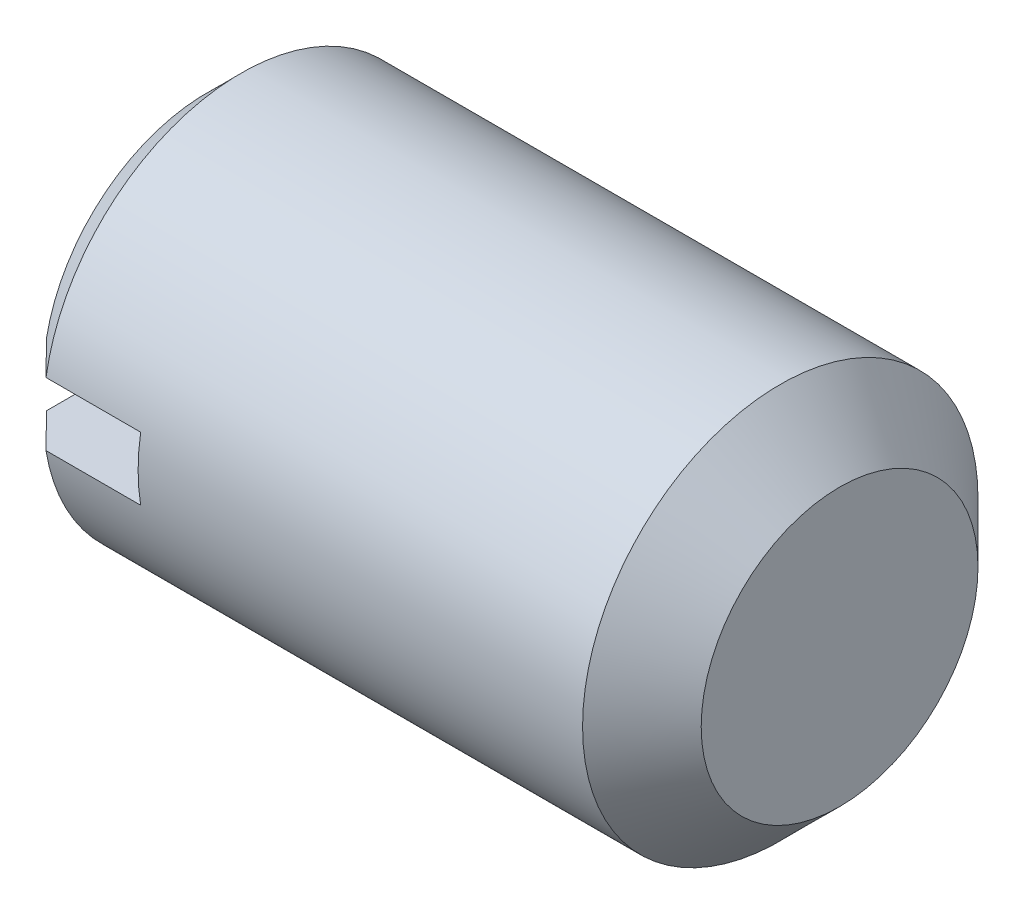
ISO-10303-21;
HEADER;
FILE_DESCRIPTION(('STEP AP214'),'2;1');
FILE_NAME('part.step','',(''),(''),'','','');
FILE_SCHEMA(('AUTOMOTIVE_DESIGN { 1 0 10303 214 1 1 1 1 }'));
ENDSEC;
DATA;
#1=APPLICATION_CONTEXT('core data for automotive mechanical design processes');
#2=APPLICATION_PROTOCOL_DEFINITION('international standard','automotive_design',2000,#1);
#3=PRODUCT_CONTEXT('',#1,'mechanical');
#4=PRODUCT('Part','Part','',(#3));
#5=PRODUCT_RELATED_PRODUCT_CATEGORY('part','',(#4));
#6=PRODUCT_DEFINITION_FORMATION('','',#4);
#7=PRODUCT_DEFINITION_CONTEXT('part definition',#1,'design');
#8=PRODUCT_DEFINITION('design','',#6,#7);
#9=PRODUCT_DEFINITION_SHAPE('','',#8);
#10=(LENGTH_UNIT() NAMED_UNIT(*) SI_UNIT(.MILLI.,.METRE.));
#11=(NAMED_UNIT(*) PLANE_ANGLE_UNIT() SI_UNIT($,.RADIAN.));
#12=(NAMED_UNIT(*) SI_UNIT($,.STERADIAN.) SOLID_ANGLE_UNIT());
#13=UNCERTAINTY_MEASURE_WITH_UNIT(LENGTH_MEASURE(1.E-05),#10,'distance_accuracy_value','');
#14=(GEOMETRIC_REPRESENTATION_CONTEXT(3) GLOBAL_UNCERTAINTY_ASSIGNED_CONTEXT((#13)) GLOBAL_UNIT_ASSIGNED_CONTEXT((#10,
#11,#12)) REPRESENTATION_CONTEXT('',''));
#15=CARTESIAN_POINT('',(0.,0.,0.));
#16=DIRECTION('',(0.,0.,1.));
#17=DIRECTION('',(1.,0.,0.));
#18=AXIS2_PLACEMENT_3D('',#15,#16,#17);
#19=CARTESIAN_POINT('',(1.63,-0.4,-2.5));
#20=DIRECTION('',(1.,0.,0.));
#21=DIRECTION('',(0.,0.,-1.));
#22=AXIS2_PLACEMENT_3D('',#19,#20,#21);
#23=PLANE('',#22);
#24=DIRECTION('',(0.,0.,1.));
#25=VECTOR('',#24,1.);
#26=CARTESIAN_POINT('',(1.63,0.4,-2.5));
#27=LINE('',#26,#25);
#28=CARTESIAN_POINT('',(1.63,0.4,2.46779253585061));
#29=VERTEX_POINT('',#28);
#30=CARTESIAN_POINT('',(1.63,0.4,-2.46779253585061));
#31=VERTEX_POINT('',#30);
#32=EDGE_CURVE('E83',#29,#31,#27,.F.);
#33=ORIENTED_EDGE('',*,*,#32,.T.);
#34=CARTESIAN_POINT('',(1.63,0.,0.));
#35=DIRECTION('',(1.,0.,0.));
#36=DIRECTION('',(0.,0.,-1.));
#37=AXIS2_PLACEMENT_3D('',#34,#35,#36);
#38=CIRCLE('',#37,2.5);
#39=CARTESIAN_POINT('',(1.63,-0.4,-2.46779253585061));
#40=VERTEX_POINT('',#39);
#41=EDGE_CURVE('E19',#40,#31,#38,.T.);
#42=ORIENTED_EDGE('',*,*,#41,.F.);
#43=DIRECTION('',(0.,0.,-1.));
#44=VECTOR('',#43,1.);
#45=CARTESIAN_POINT('',(1.63,-0.4,-2.5));
#46=LINE('',#45,#44);
#47=CARTESIAN_POINT('',(1.63,-0.4,2.46779253585061));
#48=VERTEX_POINT('',#47);
#49=EDGE_CURVE('E75',#40,#48,#46,.F.);
#50=ORIENTED_EDGE('',*,*,#49,.T.);
#51=CARTESIAN_POINT('',(1.63,0.,0.));
#52=DIRECTION('',(1.,0.,0.));
#53=DIRECTION('',(0.,0.,-1.));
#54=AXIS2_PLACEMENT_3D('',#51,#52,#53);
#55=CIRCLE('',#54,2.5);
#56=EDGE_CURVE('E85',#29,#48,#55,.T.);
#57=ORIENTED_EDGE('',*,*,#56,.F.);
#58=EDGE_LOOP('',(#33,#42,#50,#57));
#59=FACE_BOUND('',#58,.T.);
#60=ADVANCED_FACE('F16',(#59),#23,.F.);
#61=CARTESIAN_POINT('',(0.,-0.4,-2.5));
#62=DIRECTION('',(0.,-1.,0.));
#63=DIRECTION('',(0.,0.,-1.));
#64=AXIS2_PLACEMENT_3D('',#61,#62,#63);
#65=PLANE('',#64);
#66=ORIENTED_EDGE('',*,*,#49,.F.);
#67=DIRECTION('',(1.,0.,0.));
#68=VECTOR('',#67,1.);
#69=CARTESIAN_POINT('',(0.,-0.4,-2.46779253585061));
#70=LINE('',#69,#68);
#71=CARTESIAN_POINT('',(0.433012701709555,-0.4,-2.46779253585118));
#72=VERTEX_POINT('',#71);
#73=EDGE_CURVE('E66',#72,#40,#70,.T.);
#74=ORIENTED_EDGE('',*,*,#73,.F.);
#75=CARTESIAN_POINT('',(2.97636296784046E-11,-0.4,-2.02791432030155));
#76=CARTESIAN_POINT('',(0.0720577166024576,-0.4,-2.1013366976143));
#77=CARTESIAN_POINT('',(0.144170968661929,-0.4,-2.17470440622485));
#78=CARTESIAN_POINT('',(0.288508535900422,-0.4,-2.32133047806301));
#79=CARTESIAN_POINT('',(0.360732851067357,-0.4,-2.39458884130253));
#80=CARTESIAN_POINT('',(0.433012701708982,-0.4,-2.46779253585174));
#81=B_SPLINE_CURVE_WITH_KNOTS('',3,(#75,#76,#77,#78,#79,#80),.UNSPECIFIED.,.F.,.F.,(4,2,4),(0.,
0.308623194371705,0.61724635515649),.UNSPECIFIED.);
#82=CARTESIAN_POINT('',(4.33035223702997E-11,-0.4,-2.02791432031535));
#83=VERTEX_POINT('',#82);
#84=EDGE_CURVE('E76',#83,#72,#81,.T.);
#85=ORIENTED_EDGE('',*,*,#84,.F.);
#86=DIRECTION('',(0.,0.,1.));
#87=VECTOR('',#86,1.);
#88=CARTESIAN_POINT('',(0.,-0.4,0.));
#89=LINE('',#88,#87);
#90=CARTESIAN_POINT('',(4.3303489717483E-11,-0.4,2.02791432031535));
#91=VERTEX_POINT('',#90);
#92=EDGE_CURVE('E233',#91,#83,#89,.F.);
#93=ORIENTED_EDGE('',*,*,#92,.F.);
#94=CARTESIAN_POINT('',(0.433012701708842,-0.4,2.4677925358516));
#95=CARTESIAN_POINT('',(0.360732851067241,-0.4,2.39458884130241));
#96=CARTESIAN_POINT('',(0.288508535900329,-0.4,2.32133047806292));
#97=CARTESIAN_POINT('',(0.144170968661882,-0.4,2.1747044062248));
#98=CARTESIAN_POINT('',(0.0720577166024343,-0.4,2.10133669761427));
#99=CARTESIAN_POINT('',(2.97638419043523E-11,-0.4,2.02791432030155));
#100=B_SPLINE_CURVE_WITH_KNOTS('',3,(#94,#95,#96,#97,#98,#99),.UNSPECIFIED.,.F.,.F.,(4,2,4),(0.,
0.308623160784685,0.617246355156291),.UNSPECIFIED.);
#101=CARTESIAN_POINT('',(0.433012701708996,-0.4,2.46779253585061));
#102=VERTEX_POINT('',#101);
#103=EDGE_CURVE('E137',#102,#91,#100,.T.);
#104=ORIENTED_EDGE('',*,*,#103,.F.);
#105=DIRECTION('',(1.,0.,0.));
#106=VECTOR('',#105,1.);
#107=CARTESIAN_POINT('',(0.,-0.4,2.46779253585061));
#108=LINE('',#107,#106);
#109=EDGE_CURVE('E88',#48,#102,#108,.F.);
#110=ORIENTED_EDGE('',*,*,#109,.F.);
#111=EDGE_LOOP('',(#66,#74,#85,#93,#104,#110));
#112=FACE_BOUND('',#111,.T.);
#113=ADVANCED_FACE('F86',(#112),#65,.F.);
#114=CARTESIAN_POINT('',(1.63,0.4,-2.5));
#115=DIRECTION('',(0.,1.,0.));
#116=DIRECTION('',(0.,0.,1.));
#117=AXIS2_PLACEMENT_3D('',#114,#115,#116);
#118=PLANE('',#117);
#119=ORIENTED_EDGE('',*,*,#32,.F.);
#120=DIRECTION('',(1.,0.,0.));
#121=VECTOR('',#120,1.);
#122=CARTESIAN_POINT('',(1.63,0.4,2.46779253585061));
#123=LINE('',#122,#121);
#124=CARTESIAN_POINT('',(0.433012701709555,0.4,2.46779253585118));
#125=VERTEX_POINT('',#124);
#126=EDGE_CURVE('E111',#125,#29,#123,.T.);
#127=ORIENTED_EDGE('',*,*,#126,.F.);
#128=CARTESIAN_POINT('',(2.97684486386086E-11,0.4,2.02791432030156));
#129=CARTESIAN_POINT('',(0.0720577166024617,0.4,2.1013366976143));
#130=CARTESIAN_POINT('',(0.144170968661932,0.4,2.17470440622485));
#131=CARTESIAN_POINT('',(0.288508535900424,0.4,2.32133047806301));
#132=CARTESIAN_POINT('',(0.360732851067358,0.4,2.39458884130253));
#133=CARTESIAN_POINT('',(0.433012701708982,0.4,2.46779253585174));
#134=B_SPLINE_CURVE_WITH_KNOTS('',3,(#128,#129,#130,#131,#132,#133),.UNSPECIFIED.,.F.,.F.,(4,2,
4),(0.,0.308623194371702,0.617246355156483),.UNSPECIFIED.);
#135=CARTESIAN_POINT('',(4.33060865763795E-11,0.400000000000002,2.02791432031535));
#136=VERTEX_POINT('',#135);
#137=EDGE_CURVE('E103',#136,#125,#134,.T.);
#138=ORIENTED_EDGE('',*,*,#137,.F.);
#139=DIRECTION('',(0.,0.,1.));
#140=VECTOR('',#139,1.);
#141=CARTESIAN_POINT('',(0.,0.400000000000003,0.));
#142=LINE('',#141,#140);
#143=CARTESIAN_POINT('',(4.33039049623664E-11,0.400000000000002,-2.02791432031535));
#144=VERTEX_POINT('',#143);
#145=EDGE_CURVE('E102',#144,#136,#142,.T.);
#146=ORIENTED_EDGE('',*,*,#145,.F.);
#147=CARTESIAN_POINT('',(0.433012701708842,0.4,-2.4677925358516));
#148=CARTESIAN_POINT('',(0.360732851067241,0.4,-2.39458884130241));
#149=CARTESIAN_POINT('',(0.288508535900329,0.4,-2.32133047806292));
#150=CARTESIAN_POINT('',(0.144170968661882,0.4,-2.1747044062248));
#151=CARTESIAN_POINT('',(0.0720577166024346,0.4,-2.10133669761428));
#152=CARTESIAN_POINT('',(2.97640419057564E-11,0.4,-2.02791432030155));
#153=B_SPLINE_CURVE_WITH_KNOTS('',3,(#147,#148,#149,#150,#151,#152),.UNSPECIFIED.,.F.,.F.,(4,2,
4),(0.,0.308623160784685,0.61724635515629),.UNSPECIFIED.);
#154=CARTESIAN_POINT('',(0.433012701708996,0.4,-2.46779253585061));
#155=VERTEX_POINT('',#154);
#156=EDGE_CURVE('E34',#155,#144,#153,.T.);
#157=ORIENTED_EDGE('',*,*,#156,.F.);
#158=DIRECTION('',(1.,0.,0.));
#159=VECTOR('',#158,1.);
#160=CARTESIAN_POINT('',(1.63,0.4,-2.46779253585061));
#161=LINE('',#160,#159);
#162=EDGE_CURVE('E234',#31,#155,#161,.F.);
#163=ORIENTED_EDGE('',*,*,#162,.F.);
#164=EDGE_LOOP('',(#119,#127,#138,#146,#157,#163));
#165=FACE_BOUND('',#164,.T.);
#166=ADVANCED_FACE('F116',(#165),#118,.F.);
#167=CARTESIAN_POINT('',(8.,0.,0.));
#168=DIRECTION('',(1.,0.,0.));
#169=DIRECTION('',(0.,0.,-1.));
#170=AXIS2_PLACEMENT_3D('',#167,#168,#169);
#171=PLANE('',#170);
#172=CARTESIAN_POINT('',(7.99999999998136,0.,0.));
#173=DIRECTION('',(-1.,0.,0.));
#174=DIRECTION('',(0.,0.,1.));
#175=AXIS2_PLACEMENT_3D('',#172,#173,#174);
#176=CIRCLE('',#175,1.75000000001546);
#177=CARTESIAN_POINT('',(7.99999999998136,0.,1.75000000001546));
#178=VERTEX_POINT('',#177);
#179=EDGE_CURVE('E99',#178,#178,#176,.T.);
#180=ORIENTED_EDGE('',*,*,#179,.F.);
#181=EDGE_LOOP('',(#180));
#182=FACE_BOUND('',#181,.T.);
#183=ADVANCED_FACE('F149',(#182),#171,.T.);
#184=CARTESIAN_POINT('',(0.,0.,0.));
#185=DIRECTION('',(-1.,0.,0.));
#186=DIRECTION('',(0.,0.,1.));
#187=AXIS2_PLACEMENT_3D('',#184,#185,#186);
#188=PLANE('',#187);
#189=ORIENTED_EDGE('',*,*,#92,.T.);
#190=CARTESIAN_POINT('',(5.6843418860808E-11,0.,0.));
#191=DIRECTION('',(1.,0.,0.));
#192=DIRECTION('',(0.,0.,-1.));
#193=AXIS2_PLACEMENT_3D('',#190,#191,#192);
#194=CIRCLE('',#193,2.0669872981216);
#195=EDGE_CURVE('E96',#91,#83,#194,.T.);
#196=ORIENTED_EDGE('',*,*,#195,.F.);
#197=EDGE_LOOP('',(#189,#196));
#198=FACE_BOUND('',#197,.T.);
#199=ADVANCED_FACE('F177',(#198),#188,.T.);
#200=CARTESIAN_POINT('',(0.,0.,0.));
#201=DIRECTION('',(-1.,0.,0.));
#202=DIRECTION('',(0.,0.,1.));
#203=AXIS2_PLACEMENT_3D('',#200,#201,#202);
#204=PLANE('',#203);
#205=ORIENTED_EDGE('',*,*,#145,.T.);
#206=CARTESIAN_POINT('',(5.6843852541677E-11,0.,0.));
#207=DIRECTION('',(1.,0.,0.));
#208=DIRECTION('',(0.,0.,-1.));
#209=AXIS2_PLACEMENT_3D('',#206,#207,#208);
#210=CIRCLE('',#209,2.0669872981216);
#211=EDGE_CURVE('E94',#144,#136,#210,.T.);
#212=ORIENTED_EDGE('',*,*,#211,.F.);
#213=EDGE_LOOP('',(#205,#212));
#214=FACE_BOUND('',#213,.T.);
#215=ADVANCED_FACE('F170',(#214),#204,.T.);
#216=CARTESIAN_POINT('',(7.24999999999909,0.,0.));
#217=DIRECTION('',(-1.,0.,0.));
#218=DIRECTION('',(0.,0.,1.));
#219=AXIS2_PLACEMENT_3D('',#216,#217,#218);
#220=CONICAL_SURFACE('',#219,2.49999999999773,0.785398163397448);
#221=CARTESIAN_POINT('',(7.24999999999999,0.,0.));
#222=DIRECTION('',(1.,0.,0.));
#223=DIRECTION('',(0.,0.,-1.));
#224=AXIS2_PLACEMENT_3D('',#221,#222,#223);
#225=CIRCLE('',#224,2.5);
#226=CARTESIAN_POINT('',(7.24999999999999,0.,-2.5));
#227=VERTEX_POINT('',#226);
#228=EDGE_CURVE('E93',#227,#227,#225,.F.);
#229=ORIENTED_EDGE('',*,*,#228,.F.);
#230=EDGE_LOOP('',(#229));
#231=FACE_BOUND('',#230,.T.);
#232=ORIENTED_EDGE('',*,*,#179,.T.);
#233=EDGE_LOOP('',(#232));
#234=FACE_BOUND('',#233,.T.);
#235=ADVANCED_FACE('F129',(#231,#234),#220,.T.);
#236=CARTESIAN_POINT('',(0.433012701705593,0.,0.));
#237=DIRECTION('',(1.,0.,0.));
#238=DIRECTION('',(0.,0.,-1.));
#239=AXIS2_PLACEMENT_3D('',#236,#237,#238);
#240=CONICAL_SURFACE('',#239,2.49999999999773,0.785398163659997);
#241=ORIENTED_EDGE('',*,*,#103,.T.);
#242=ORIENTED_EDGE('',*,*,#195,.T.);
#243=ORIENTED_EDGE('',*,*,#84,.T.);
#244=CARTESIAN_POINT('',(0.433012701710128,0.,0.));
#245=DIRECTION('',(1.,0.,0.));
#246=DIRECTION('',(0.,0.,-1.));
#247=AXIS2_PLACEMENT_3D('',#244,#245,#246);
#248=CIRCLE('',#247,2.5);
#249=EDGE_CURVE('E25',#102,#72,#248,.T.);
#250=ORIENTED_EDGE('',*,*,#249,.F.);
#251=EDGE_LOOP('',(#241,#242,#243,#250));
#252=FACE_BOUND('',#251,.T.);
#253=ADVANCED_FACE('F124',(#252),#240,.T.);
#254=CARTESIAN_POINT('',(0.433012701705593,0.,0.));
#255=DIRECTION('',(1.,0.,0.));
#256=DIRECTION('',(0.,0.,-1.));
#257=AXIS2_PLACEMENT_3D('',#254,#255,#256);
#258=CONICAL_SURFACE('',#257,2.49999999999773,0.785398163659997);
#259=ORIENTED_EDGE('',*,*,#156,.T.);
#260=ORIENTED_EDGE('',*,*,#211,.T.);
#261=ORIENTED_EDGE('',*,*,#137,.T.);
#262=CARTESIAN_POINT('',(0.433012701710128,0.,0.));
#263=DIRECTION('',(1.,0.,0.));
#264=DIRECTION('',(0.,0.,-1.));
#265=AXIS2_PLACEMENT_3D('',#262,#263,#264);
#266=CIRCLE('',#265,2.5);
#267=EDGE_CURVE('E11',#155,#125,#266,.T.);
#268=ORIENTED_EDGE('',*,*,#267,.F.);
#269=EDGE_LOOP('',(#259,#260,#261,#268));
#270=FACE_BOUND('',#269,.T.);
#271=ADVANCED_FACE('F119',(#270),#258,.T.);
#272=CARTESIAN_POINT('',(0.433012701710128,0.,0.));
#273=DIRECTION('',(1.,0.,0.));
#274=DIRECTION('',(0.,0.,-1.));
#275=AXIS2_PLACEMENT_3D('',#272,#273,#274);
#276=CYLINDRICAL_SURFACE('',#275,2.5);
#277=ORIENTED_EDGE('',*,*,#267,.T.);
#278=ORIENTED_EDGE('',*,*,#126,.T.);
#279=ORIENTED_EDGE('',*,*,#56,.T.);
#280=ORIENTED_EDGE('',*,*,#109,.T.);
#281=ORIENTED_EDGE('',*,*,#249,.T.);
#282=ORIENTED_EDGE('',*,*,#73,.T.);
#283=ORIENTED_EDGE('',*,*,#41,.T.);
#284=ORIENTED_EDGE('',*,*,#162,.T.);
#285=EDGE_LOOP('',(#277,#278,#279,#280,#281,#282,#283,#284));
#286=FACE_BOUND('',#285,.T.);
#287=ORIENTED_EDGE('',*,*,#228,.T.);
#288=EDGE_LOOP('',(#287));
#289=FACE_BOUND('',#288,.T.);
#290=ADVANCED_FACE('F68',(#286,#289),#276,.T.);
#291=CLOSED_SHELL('',(#60,#113,#166,#183,#199,#215,#235,#253,#271,#290));
#292=MANIFOLD_SOLID_BREP('B1',#291);
#293=ADVANCED_BREP_SHAPE_REPRESENTATION('',(#18,#292),#14);
#294=SHAPE_DEFINITION_REPRESENTATION(#9,#293);
ENDSEC;
END-ISO-10303-21;
